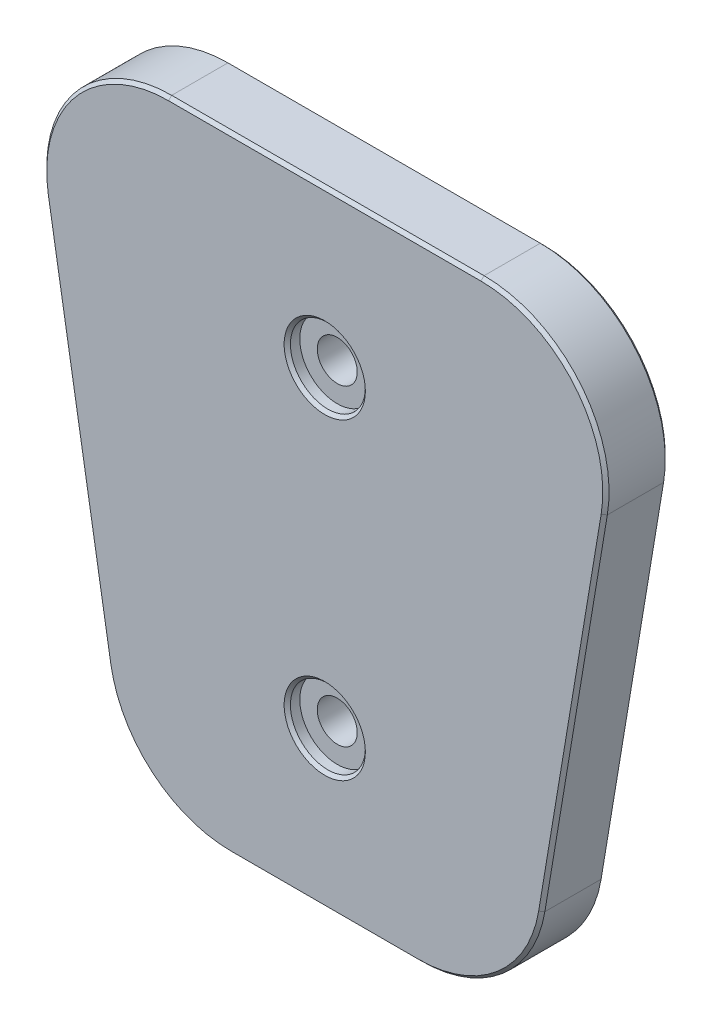
ISO-10303-21;
HEADER;
FILE_DESCRIPTION(('STEP AP214'),'2;1');
FILE_NAME('part.step','',(''),(''),'','','');
FILE_SCHEMA(('AUTOMOTIVE_DESIGN { 1 0 10303 214 1 1 1 1 }'));
ENDSEC;
DATA;
#1=APPLICATION_CONTEXT('core data for automotive mechanical design processes');
#2=APPLICATION_PROTOCOL_DEFINITION('international standard','automotive_design',2000,#1);
#3=PRODUCT_CONTEXT('',#1,'mechanical');
#4=PRODUCT('Part','Part','',(#3));
#5=PRODUCT_RELATED_PRODUCT_CATEGORY('part','',(#4));
#6=PRODUCT_DEFINITION_FORMATION('','',#4);
#7=PRODUCT_DEFINITION_CONTEXT('part definition',#1,'design');
#8=PRODUCT_DEFINITION('design','',#6,#7);
#9=PRODUCT_DEFINITION_SHAPE('','',#8);
#10=(LENGTH_UNIT() NAMED_UNIT(*) SI_UNIT(.MILLI.,.METRE.));
#11=(NAMED_UNIT(*) PLANE_ANGLE_UNIT() SI_UNIT($,.RADIAN.));
#12=(NAMED_UNIT(*) SI_UNIT($,.STERADIAN.) SOLID_ANGLE_UNIT());
#13=UNCERTAINTY_MEASURE_WITH_UNIT(LENGTH_MEASURE(1.E-05),#10,'distance_accuracy_value','');
#14=(GEOMETRIC_REPRESENTATION_CONTEXT(3) GLOBAL_UNCERTAINTY_ASSIGNED_CONTEXT((#13)) GLOBAL_UNIT_ASSIGNED_CONTEXT((#10,
#11,#12)) REPRESENTATION_CONTEXT('',''));
#15=CARTESIAN_POINT('',(0.,0.,0.));
#16=DIRECTION('',(0.,0.,1.));
#17=DIRECTION('',(1.,0.,0.));
#18=AXIS2_PLACEMENT_3D('',#15,#16,#17);
#19=CARTESIAN_POINT('',(-6.3552835393436,-23.2879797461072,10.));
#20=DIRECTION('',(0.986393923832144,0.164398987305357,0.));
#21=DIRECTION('',(-0.164398987305357,0.986393923832144,0.));
#22=AXIS2_PLACEMENT_3D('',#19,#20,#21);
#23=PLANE('',#22);
#24=DIRECTION('',(0.,0.,-1.));
#25=VECTOR('',#24,1.);
#26=CARTESIAN_POINT('',(-6.3552835393436,-23.2879797461072,10.));
#27=LINE('',#26,#25);
#28=CARTESIAN_POINT('',(-6.3552835393436,-23.2879797461072,9.49999999999999));
#29=VERTEX_POINT('',#28);
#30=CARTESIAN_POINT('',(-6.3552835393436,-23.2879797461072,0.499999999999999));
#31=VERTEX_POINT('',#30);
#32=EDGE_CURVE('E339',#29,#31,#27,.T.);
#33=ORIENTED_EDGE('',*,*,#32,.T.);
#34=DIRECTION('',(0.164398987305357,-0.986393923832144,0.));
#35=VECTOR('',#34,1.);
#36=CARTESIAN_POINT('',(-6.3552835393436,-23.2879797461072,0.499999999999999));
#37=LINE('',#36,#35);
#38=CARTESIAN_POINT('',(3.6447164606564,-83.2879797461072,0.499999999999999));
#39=VERTEX_POINT('',#38);
#40=EDGE_CURVE('E247',#31,#39,#37,.T.);
#41=ORIENTED_EDGE('',*,*,#40,.T.);
#42=DIRECTION('',(0.,0.,-1.));
#43=VECTOR('',#42,1.);
#44=CARTESIAN_POINT('',(3.6447164606564,-83.2879797461072,10.));
#45=LINE('',#44,#43);
#46=CARTESIAN_POINT('',(3.6447164606564,-83.2879797461072,9.49999999999999));
#47=VERTEX_POINT('',#46);
#48=EDGE_CURVE('E180',#47,#39,#45,.T.);
#49=ORIENTED_EDGE('',*,*,#48,.F.);
#50=DIRECTION('',(-0.164398987305357,0.986393923832144,0.));
#51=VECTOR('',#50,1.);
#52=CARTESIAN_POINT('',(-6.3552835393436,-23.2879797461072,9.49999999999999));
#53=LINE('',#52,#51);
#54=EDGE_CURVE('E245',#47,#29,#53,.T.);
#55=ORIENTED_EDGE('',*,*,#54,.T.);
#56=EDGE_LOOP('',(#33,#41,#49,#55));
#57=FACE_BOUND('',#56,.T.);
#58=ADVANCED_FACE('F41',(#57),#23,.F.);
#59=CARTESIAN_POINT('',(23.3725949372993,-80.,10.));
#60=DIRECTION('',(0.,0.,-1.));
#61=DIRECTION('',(-1.,0.,0.));
#62=AXIS2_PLACEMENT_3D('',#59,#60,#61);
#63=CYLINDRICAL_SURFACE('',#62,20.);
#64=ORIENTED_EDGE('',*,*,#48,.T.);
#65=CARTESIAN_POINT('',(23.3725949372993,-80.,0.5));
#66=DIRECTION('',(0.,0.,1.));
#67=DIRECTION('',(1.,0.,0.));
#68=AXIS2_PLACEMENT_3D('',#65,#66,#67);
#69=CIRCLE('',#68,20.);
#70=CARTESIAN_POINT('',(23.3725949372993,-100.,0.5));
#71=VERTEX_POINT('',#70);
#72=EDGE_CURVE('E179',#39,#71,#69,.T.);
#73=ORIENTED_EDGE('',*,*,#72,.T.);
#74=DIRECTION('',(0.,0.,-1.));
#75=VECTOR('',#74,1.);
#76=CARTESIAN_POINT('',(23.3725949372993,-100.,10.));
#77=LINE('',#76,#75);
#78=CARTESIAN_POINT('',(23.3725949372993,-100.,9.49999999999999));
#79=VERTEX_POINT('',#78);
#80=EDGE_CURVE('E161',#79,#71,#77,.T.);
#81=ORIENTED_EDGE('',*,*,#80,.F.);
#82=CARTESIAN_POINT('',(23.3725949372993,-80.,9.49999999999999));
#83=DIRECTION('',(0.,0.,1.));
#84=DIRECTION('',(1.,0.,0.));
#85=AXIS2_PLACEMENT_3D('',#82,#83,#84);
#86=CIRCLE('',#85,20.);
#87=EDGE_CURVE('E176',#79,#47,#86,.F.);
#88=ORIENTED_EDGE('',*,*,#87,.T.);
#89=EDGE_LOOP('',(#64,#73,#81,#88));
#90=FACE_BOUND('',#89,.T.);
#91=ADVANCED_FACE('F174',(#90),#63,.T.);
#92=CARTESIAN_POINT('',(23.3725949372993,-100.,10.));
#93=DIRECTION('',(0.,1.,0.));
#94=DIRECTION('',(0.,0.,1.));
#95=AXIS2_PLACEMENT_3D('',#92,#93,#94);
#96=PLANE('',#95);
#97=ORIENTED_EDGE('',*,*,#80,.T.);
#98=DIRECTION('',(1.,0.,0.));
#99=VECTOR('',#98,1.);
#100=CARTESIAN_POINT('',(23.3725949372993,-100.,0.5));
#101=LINE('',#100,#99);
#102=CARTESIAN_POINT('',(53.3725949372993,-100.,0.5));
#103=VERTEX_POINT('',#102);
#104=EDGE_CURVE('E168',#71,#103,#101,.T.);
#105=ORIENTED_EDGE('',*,*,#104,.T.);
#106=DIRECTION('',(0.,0.,-1.));
#107=VECTOR('',#106,1.);
#108=CARTESIAN_POINT('',(53.3725949372993,-100.,10.));
#109=LINE('',#108,#107);
#110=CARTESIAN_POINT('',(53.3725949372993,-100.,9.49999999999999));
#111=VERTEX_POINT('',#110);
#112=EDGE_CURVE('E163',#111,#103,#109,.T.);
#113=ORIENTED_EDGE('',*,*,#112,.F.);
#114=DIRECTION('',(-1.,0.,0.));
#115=VECTOR('',#114,1.);
#116=CARTESIAN_POINT('',(23.3725949372993,-100.,9.49999999999999));
#117=LINE('',#116,#115);
#118=EDGE_CURVE('E158',#111,#79,#117,.T.);
#119=ORIENTED_EDGE('',*,*,#118,.T.);
#120=EDGE_LOOP('',(#97,#105,#113,#119));
#121=FACE_BOUND('',#120,.T.);
#122=ADVANCED_FACE('F160',(#121),#96,.F.);
#123=CARTESIAN_POINT('',(53.3725949372993,-80.,10.));
#124=DIRECTION('',(0.,0.,-1.));
#125=DIRECTION('',(-1.,0.,0.));
#126=AXIS2_PLACEMENT_3D('',#123,#124,#125);
#127=CYLINDRICAL_SURFACE('',#126,20.);
#128=ORIENTED_EDGE('',*,*,#112,.T.);
#129=CARTESIAN_POINT('',(53.3725949372993,-80.,0.5));
#130=DIRECTION('',(0.,0.,1.));
#131=DIRECTION('',(1.,0.,0.));
#132=AXIS2_PLACEMENT_3D('',#129,#130,#131);
#133=CIRCLE('',#132,20.);
#134=CARTESIAN_POINT('',(73.1004734139422,-83.2879797461072,0.5));
#135=VERTEX_POINT('',#134);
#136=EDGE_CURVE('E226',#103,#135,#133,.T.);
#137=ORIENTED_EDGE('',*,*,#136,.T.);
#138=DIRECTION('',(0.,0.,-1.));
#139=VECTOR('',#138,1.);
#140=CARTESIAN_POINT('',(73.1004734139422,-83.2879797461072,10.));
#141=LINE('',#140,#139);
#142=CARTESIAN_POINT('',(73.1004734139422,-83.2879797461072,9.49999999999999));
#143=VERTEX_POINT('',#142);
#144=EDGE_CURVE('E324',#143,#135,#141,.T.);
#145=ORIENTED_EDGE('',*,*,#144,.F.);
#146=CARTESIAN_POINT('',(53.3725949372993,-80.,9.49999999999999));
#147=DIRECTION('',(0.,0.,1.));
#148=DIRECTION('',(1.,0.,0.));
#149=AXIS2_PLACEMENT_3D('',#146,#147,#148);
#150=CIRCLE('',#149,20.);
#151=EDGE_CURVE('E224',#143,#111,#150,.F.);
#152=ORIENTED_EDGE('',*,*,#151,.T.);
#153=EDGE_LOOP('',(#128,#137,#145,#152));
#154=FACE_BOUND('',#153,.T.);
#155=ADVANCED_FACE('F321',(#154),#127,.T.);
#156=CARTESIAN_POINT('',(73.1004734139422,-83.2879797461071,10.));
#157=DIRECTION('',(-0.986393923832144,0.164398987305357,0.));
#158=DIRECTION('',(-0.164398987305357,-0.986393923832144,0.));
#159=AXIS2_PLACEMENT_3D('',#156,#157,#158);
#160=PLANE('',#159);
#161=ORIENTED_EDGE('',*,*,#144,.T.);
#162=DIRECTION('',(0.164398987305357,0.986393923832144,0.));
#163=VECTOR('',#162,1.);
#164=CARTESIAN_POINT('',(73.1004734139422,-83.2879797461071,0.5));
#165=LINE('',#164,#163);
#166=CARTESIAN_POINT('',(83.1004734139421,-23.2879797461071,0.5));
#167=VERTEX_POINT('',#166);
#168=EDGE_CURVE('E230',#135,#167,#165,.T.);
#169=ORIENTED_EDGE('',*,*,#168,.T.);
#170=DIRECTION('',(0.,0.,-1.));
#171=VECTOR('',#170,1.);
#172=CARTESIAN_POINT('',(83.1004734139421,-23.2879797461071,10.));
#173=LINE('',#172,#171);
#174=CARTESIAN_POINT('',(83.1004734139421,-23.2879797461071,9.49999999999999));
#175=VERTEX_POINT('',#174);
#176=EDGE_CURVE('E327',#175,#167,#173,.T.);
#177=ORIENTED_EDGE('',*,*,#176,.F.);
#178=DIRECTION('',(-0.164398987305357,-0.986393923832144,0.));
#179=VECTOR('',#178,1.);
#180=CARTESIAN_POINT('',(73.1004734139422,-83.2879797461072,9.49999999999999));
#181=LINE('',#180,#179);
#182=EDGE_CURVE('E228',#175,#143,#181,.T.);
#183=ORIENTED_EDGE('',*,*,#182,.T.);
#184=EDGE_LOOP('',(#161,#169,#177,#183));
#185=FACE_BOUND('',#184,.T.);
#186=ADVANCED_FACE('F541',(#185),#160,.F.);
#187=CARTESIAN_POINT('',(63.3725949372993,-20.,10.));
#188=DIRECTION('',(0.,0.,-1.));
#189=DIRECTION('',(-1.,0.,0.));
#190=AXIS2_PLACEMENT_3D('',#187,#188,#189);
#191=CYLINDRICAL_SURFACE('',#190,20.);
#192=ORIENTED_EDGE('',*,*,#176,.T.);
#193=CARTESIAN_POINT('',(63.3725949372993,-20.,0.5));
#194=DIRECTION('',(0.,0.,1.));
#195=DIRECTION('',(1.,0.,0.));
#196=AXIS2_PLACEMENT_3D('',#193,#194,#195);
#197=CIRCLE('',#196,20.);
#198=CARTESIAN_POINT('',(63.3725949372993,0.,0.5));
#199=VERTEX_POINT('',#198);
#200=EDGE_CURVE('E234',#167,#199,#197,.T.);
#201=ORIENTED_EDGE('',*,*,#200,.T.);
#202=DIRECTION('',(0.,0.,-1.));
#203=VECTOR('',#202,1.);
#204=CARTESIAN_POINT('',(63.3725949372993,0.,10.));
#205=LINE('',#204,#203);
#206=CARTESIAN_POINT('',(63.3725949372993,0.,9.49999999999999));
#207=VERTEX_POINT('',#206);
#208=EDGE_CURVE('E331',#207,#199,#205,.T.);
#209=ORIENTED_EDGE('',*,*,#208,.F.);
#210=CARTESIAN_POINT('',(63.3725949372993,-20.,9.49999999999999));
#211=DIRECTION('',(0.,0.,1.));
#212=DIRECTION('',(1.,0.,0.));
#213=AXIS2_PLACEMENT_3D('',#210,#211,#212);
#214=CIRCLE('',#213,20.);
#215=EDGE_CURVE('E232',#207,#175,#214,.F.);
#216=ORIENTED_EDGE('',*,*,#215,.T.);
#217=EDGE_LOOP('',(#192,#201,#209,#216));
#218=FACE_BOUND('',#217,.T.);
#219=ADVANCED_FACE('F537',(#218),#191,.T.);
#220=CARTESIAN_POINT('',(13.3725949372993,0.,10.));
#221=DIRECTION('',(0.,1.,0.));
#222=DIRECTION('',(-1.,0.,0.));
#223=AXIS2_PLACEMENT_3D('',#220,#221,#222);
#224=PLANE('',#223);
#225=ORIENTED_EDGE('',*,*,#208,.T.);
#226=DIRECTION('',(-1.,0.,0.));
#227=VECTOR('',#226,1.);
#228=CARTESIAN_POINT('',(13.3725949372993,0.,0.5));
#229=LINE('',#228,#227);
#230=CARTESIAN_POINT('',(13.3725949372993,0.,0.5));
#231=VERTEX_POINT('',#230);
#232=EDGE_CURVE('E238',#199,#231,#229,.T.);
#233=ORIENTED_EDGE('',*,*,#232,.T.);
#234=DIRECTION('',(0.,0.,-1.));
#235=VECTOR('',#234,1.);
#236=CARTESIAN_POINT('',(13.3725949372993,0.,10.));
#237=LINE('',#236,#235);
#238=CARTESIAN_POINT('',(13.3725949372993,0.,9.49999999999999));
#239=VERTEX_POINT('',#238);
#240=EDGE_CURVE('E336',#239,#231,#237,.T.);
#241=ORIENTED_EDGE('',*,*,#240,.F.);
#242=DIRECTION('',(1.,0.,0.));
#243=VECTOR('',#242,1.);
#244=CARTESIAN_POINT('',(13.3725949372993,0.,9.49999999999999));
#245=LINE('',#244,#243);
#246=EDGE_CURVE('E236',#239,#207,#245,.T.);
#247=ORIENTED_EDGE('',*,*,#246,.T.);
#248=EDGE_LOOP('',(#225,#233,#241,#247));
#249=FACE_BOUND('',#248,.T.);
#250=ADVANCED_FACE('F533',(#249),#224,.T.);
#251=CARTESIAN_POINT('',(13.3725949372993,-20.,10.));
#252=DIRECTION('',(0.,0.,-1.));
#253=DIRECTION('',(-1.,0.,0.));
#254=AXIS2_PLACEMENT_3D('',#251,#252,#253);
#255=CYLINDRICAL_SURFACE('',#254,20.);
#256=ORIENTED_EDGE('',*,*,#240,.T.);
#257=CARTESIAN_POINT('',(13.3725949372993,-20.,0.5));
#258=DIRECTION('',(0.,0.,1.));
#259=DIRECTION('',(1.,0.,0.));
#260=AXIS2_PLACEMENT_3D('',#257,#258,#259);
#261=CIRCLE('',#260,20.);
#262=EDGE_CURVE('E243',#231,#31,#261,.T.);
#263=ORIENTED_EDGE('',*,*,#262,.T.);
#264=ORIENTED_EDGE('',*,*,#32,.F.);
#265=CARTESIAN_POINT('',(13.3725949372993,-20.,9.49999999999999));
#266=DIRECTION('',(0.,0.,1.));
#267=DIRECTION('',(1.,0.,0.));
#268=AXIS2_PLACEMENT_3D('',#265,#266,#267);
#269=CIRCLE('',#268,20.);
#270=EDGE_CURVE('E240',#29,#239,#269,.F.);
#271=ORIENTED_EDGE('',*,*,#270,.T.);
#272=EDGE_LOOP('',(#256,#263,#264,#271));
#273=FACE_BOUND('',#272,.T.);
#274=ADVANCED_FACE('F529',(#273),#255,.T.);
#275=CARTESIAN_POINT('',(23.3725949372993,-80.,10.));
#276=DIRECTION('',(0.,0.,1.));
#277=DIRECTION('',(1.,0.,0.));
#278=AXIS2_PLACEMENT_3D('',#275,#276,#277);
#279=PLANE('',#278);
#280=DIRECTION('',(-1.,0.,0.));
#281=VECTOR('',#280,1.);
#282=CARTESIAN_POINT('',(23.3725949372993,-0.500000000000014,10.));
#283=LINE('',#282,#281);
#284=CARTESIAN_POINT('',(63.3725949372993,-0.500000000000016,10.));
#285=VERTEX_POINT('',#284);
#286=CARTESIAN_POINT('',(13.3725949372993,-0.500000000000016,10.));
#287=VERTEX_POINT('',#286);
#288=EDGE_CURVE('E59',#285,#287,#283,.T.);
#289=ORIENTED_EDGE('',*,*,#288,.T.);
#290=CARTESIAN_POINT('',(13.3725949372993,-20.,10.));
#291=DIRECTION('',(0.,0.,1.));
#292=DIRECTION('',(1.,0.,0.));
#293=AXIS2_PLACEMENT_3D('',#290,#291,#292);
#294=CIRCLE('',#293,19.5);
#295=CARTESIAN_POINT('',(-5.86208657742751,-23.2057802524545,10.));
#296=VERTEX_POINT('',#295);
#297=EDGE_CURVE('E272',#287,#296,#294,.T.);
#298=ORIENTED_EDGE('',*,*,#297,.T.);
#299=DIRECTION('',(0.164398987305357,-0.986393923832144,0.));
#300=VECTOR('',#299,1.);
#301=CARTESIAN_POINT('',(4.13791342257249,-83.2057802524545,10.));
#302=LINE('',#301,#300);
#303=CARTESIAN_POINT('',(4.13791342257249,-83.2057802524545,10.));
#304=VERTEX_POINT('',#303);
#305=EDGE_CURVE('E261',#296,#304,#302,.T.);
#306=ORIENTED_EDGE('',*,*,#305,.T.);
#307=CARTESIAN_POINT('',(23.3725949372993,-80.,10.));
#308=DIRECTION('',(0.,0.,1.));
#309=DIRECTION('',(1.,0.,0.));
#310=AXIS2_PLACEMENT_3D('',#307,#308,#309);
#311=CIRCLE('',#310,19.5);
#312=CARTESIAN_POINT('',(23.3725949372993,-99.5,10.));
#313=VERTEX_POINT('',#312);
#314=EDGE_CURVE('E263',#304,#313,#311,.T.);
#315=ORIENTED_EDGE('',*,*,#314,.T.);
#316=DIRECTION('',(1.,0.,0.));
#317=VECTOR('',#316,1.);
#318=CARTESIAN_POINT('',(53.3725949372993,-99.5,10.));
#319=LINE('',#318,#317);
#320=CARTESIAN_POINT('',(53.3725949372993,-99.5,10.));
#321=VERTEX_POINT('',#320);
#322=EDGE_CURVE('E186',#313,#321,#319,.T.);
#323=ORIENTED_EDGE('',*,*,#322,.T.);
#324=CARTESIAN_POINT('',(53.3725949372993,-80.,10.));
#325=DIRECTION('',(0.,0.,1.));
#326=DIRECTION('',(1.,0.,0.));
#327=AXIS2_PLACEMENT_3D('',#324,#325,#326);
#328=CIRCLE('',#327,19.5);
#329=CARTESIAN_POINT('',(72.6072764520261,-83.2057802524545,10.));
#330=VERTEX_POINT('',#329);
#331=EDGE_CURVE('E266',#321,#330,#328,.T.);
#332=ORIENTED_EDGE('',*,*,#331,.T.);
#333=DIRECTION('',(0.164398987305357,0.986393923832144,0.));
#334=VECTOR('',#333,1.);
#335=CARTESIAN_POINT('',(82.607276452026,-23.2057802524545,10.));
#336=LINE('',#335,#334);
#337=CARTESIAN_POINT('',(82.607276452026,-23.2057802524545,10.));
#338=VERTEX_POINT('',#337);
#339=EDGE_CURVE('E268',#330,#338,#336,.T.);
#340=ORIENTED_EDGE('',*,*,#339,.T.);
#341=CARTESIAN_POINT('',(63.3725949372993,-20.,10.));
#342=DIRECTION('',(0.,0.,1.));
#343=DIRECTION('',(1.,0.,0.));
#344=AXIS2_PLACEMENT_3D('',#341,#342,#343);
#345=CIRCLE('',#344,19.5);
#346=EDGE_CURVE('E64',#338,#285,#345,.T.);
#347=ORIENTED_EDGE('',*,*,#346,.T.);
#348=EDGE_LOOP('',(#289,#298,#306,#315,#323,#332,#340,#347));
#349=FACE_BOUND('',#348,.T.);
#350=CARTESIAN_POINT('',(38.3725949372993,-75.,10.));
#351=DIRECTION('',(0.,0.,1.));
#352=DIRECTION('',(1.,0.,0.));
#353=AXIS2_PLACEMENT_3D('',#350,#351,#352);
#354=CIRCLE('',#353,6.50000000000001);
#355=CARTESIAN_POINT('',(44.8725949372993,-75.,10.));
#356=VERTEX_POINT('',#355);
#357=EDGE_CURVE('E258',#356,#356,#354,.F.);
#358=ORIENTED_EDGE('',*,*,#357,.T.);
#359=EDGE_LOOP('',(#358));
#360=FACE_BOUND('',#359,.T.);
#361=CARTESIAN_POINT('',(38.3725949372993,-25.,10.));
#362=DIRECTION('',(0.,0.,1.));
#363=DIRECTION('',(1.,0.,0.));
#364=AXIS2_PLACEMENT_3D('',#361,#362,#363);
#365=CIRCLE('',#364,6.49999999999998);
#366=CARTESIAN_POINT('',(44.8725949372992,-25.,10.));
#367=VERTEX_POINT('',#366);
#368=EDGE_CURVE('E255',#367,#367,#365,.F.);
#369=ORIENTED_EDGE('',*,*,#368,.T.);
#370=EDGE_LOOP('',(#369));
#371=FACE_BOUND('',#370,.T.);
#372=ADVANCED_FACE('F524',(#349,#360,#371),#279,.T.);
#373=CARTESIAN_POINT('',(23.3725949372993,-80.,0.));
#374=DIRECTION('',(0.,0.,1.));
#375=DIRECTION('',(1.,0.,0.));
#376=AXIS2_PLACEMENT_3D('',#373,#374,#375);
#377=PLANE('',#376);
#378=DIRECTION('',(-1.,0.,0.));
#379=VECTOR('',#378,1.);
#380=CARTESIAN_POINT('',(23.3725949372993,-99.5,0.));
#381=LINE('',#380,#379);
#382=CARTESIAN_POINT('',(53.3725949372993,-99.5,0.));
#383=VERTEX_POINT('',#382);
#384=CARTESIAN_POINT('',(23.3725949372993,-99.5,0.));
#385=VERTEX_POINT('',#384);
#386=EDGE_CURVE('E219',#383,#385,#381,.T.);
#387=ORIENTED_EDGE('',*,*,#386,.T.);
#388=CARTESIAN_POINT('',(23.3725949372993,-80.,0.));
#389=DIRECTION('',(0.,0.,1.));
#390=DIRECTION('',(1.,0.,0.));
#391=AXIS2_PLACEMENT_3D('',#388,#389,#390);
#392=CIRCLE('',#391,19.5);
#393=CARTESIAN_POINT('',(4.13791342257246,-83.2057802524545,0.));
#394=VERTEX_POINT('',#393);
#395=EDGE_CURVE('E169',#385,#394,#392,.F.);
#396=ORIENTED_EDGE('',*,*,#395,.T.);
#397=DIRECTION('',(-0.164398987305357,0.986393923832144,0.));
#398=VECTOR('',#397,1.);
#399=CARTESIAN_POINT('',(4.13791342257245,-83.2057802524545,0.));
#400=LINE('',#399,#398);
#401=CARTESIAN_POINT('',(-5.86208657742754,-23.2057802524545,0.));
#402=VERTEX_POINT('',#401);
#403=EDGE_CURVE('E207',#394,#402,#400,.T.);
#404=ORIENTED_EDGE('',*,*,#403,.T.);
#405=CARTESIAN_POINT('',(13.3725949372993,-20.,0.));
#406=DIRECTION('',(0.,0.,1.));
#407=DIRECTION('',(1.,0.,0.));
#408=AXIS2_PLACEMENT_3D('',#405,#406,#407);
#409=CIRCLE('',#408,19.5);
#410=CARTESIAN_POINT('',(13.3725949372993,-0.499999999999995,0.));
#411=VERTEX_POINT('',#410);
#412=EDGE_CURVE('E209',#402,#411,#409,.F.);
#413=ORIENTED_EDGE('',*,*,#412,.T.);
#414=DIRECTION('',(1.,0.,0.));
#415=VECTOR('',#414,1.);
#416=CARTESIAN_POINT('',(63.3725949372993,-0.499999999999982,0.));
#417=LINE('',#416,#415);
#418=CARTESIAN_POINT('',(63.3725949372993,-0.499999999999982,0.));
#419=VERTEX_POINT('',#418);
#420=EDGE_CURVE('E211',#411,#419,#417,.T.);
#421=ORIENTED_EDGE('',*,*,#420,.T.);
#422=CARTESIAN_POINT('',(63.3725949372993,-20.,0.));
#423=DIRECTION('',(0.,0.,1.));
#424=DIRECTION('',(1.,0.,0.));
#425=AXIS2_PLACEMENT_3D('',#422,#423,#424);
#426=CIRCLE('',#425,19.5);
#427=CARTESIAN_POINT('',(82.6072764520261,-23.2057802524545,0.));
#428=VERTEX_POINT('',#427);
#429=EDGE_CURVE('E213',#419,#428,#426,.F.);
#430=ORIENTED_EDGE('',*,*,#429,.T.);
#431=DIRECTION('',(-0.164398987305357,-0.986393923832144,0.));
#432=VECTOR('',#431,1.);
#433=CARTESIAN_POINT('',(71.7964656412153,-88.0706451173193,0.));
#434=LINE('',#433,#432);
#435=CARTESIAN_POINT('',(72.6072764520261,-83.2057802524545,0.));
#436=VERTEX_POINT('',#435);
#437=EDGE_CURVE('E215',#428,#436,#434,.T.);
#438=ORIENTED_EDGE('',*,*,#437,.T.);
#439=CARTESIAN_POINT('',(53.3725949372993,-80.,0.));
#440=DIRECTION('',(0.,0.,1.));
#441=DIRECTION('',(1.,0.,0.));
#442=AXIS2_PLACEMENT_3D('',#439,#440,#441);
#443=CIRCLE('',#442,19.5);
#444=EDGE_CURVE('E217',#436,#383,#443,.F.);
#445=ORIENTED_EDGE('',*,*,#444,.T.);
#446=EDGE_LOOP('',(#387,#396,#404,#413,#421,#430,#438,#445));
#447=FACE_BOUND('',#446,.T.);
#448=CARTESIAN_POINT('',(38.3725949372993,-75.,0.));
#449=DIRECTION('',(0.,0.,1.));
#450=DIRECTION('',(1.,0.,0.));
#451=AXIS2_PLACEMENT_3D('',#448,#449,#450);
#452=CIRCLE('',#451,3.70000000000004);
#453=CARTESIAN_POINT('',(42.0725949372993,-75.,0.));
#454=VERTEX_POINT('',#453);
#455=EDGE_CURVE('E204',#454,#454,#452,.T.);
#456=ORIENTED_EDGE('',*,*,#455,.T.);
#457=EDGE_LOOP('',(#456));
#458=FACE_BOUND('',#457,.T.);
#459=CARTESIAN_POINT('',(38.3725949372993,-25.,0.));
#460=DIRECTION('',(0.,0.,1.));
#461=DIRECTION('',(1.,0.,0.));
#462=AXIS2_PLACEMENT_3D('',#459,#460,#461);
#463=CIRCLE('',#462,3.70000000000004);
#464=CARTESIAN_POINT('',(42.0725949372993,-25.,0.));
#465=VERTEX_POINT('',#464);
#466=EDGE_CURVE('E198',#465,#465,#463,.T.);
#467=ORIENTED_EDGE('',*,*,#466,.T.);
#468=EDGE_LOOP('',(#467));
#469=FACE_BOUND('',#468,.T.);
#470=ADVANCED_FACE('F518',(#447,#458,#469),#377,.F.);
#471=CARTESIAN_POINT('',(38.3725949372993,-75.,8.));
#472=DIRECTION('',(0.,0.,1.));
#473=DIRECTION('',(1.,0.,0.));
#474=AXIS2_PLACEMENT_3D('',#471,#472,#473);
#475=CYLINDRICAL_SURFACE('',#474,6.00000000000001);
#476=CARTESIAN_POINT('',(38.3725949372993,-75.,9.50000000000001));
#477=DIRECTION('',(0.,0.,1.));
#478=DIRECTION('',(1.,0.,0.));
#479=AXIS2_PLACEMENT_3D('',#476,#477,#478);
#480=CIRCLE('',#479,6.00000000000001);
#481=CARTESIAN_POINT('',(44.3725949372993,-75.,9.50000000000001));
#482=VERTEX_POINT('',#481);
#483=EDGE_CURVE('E51',#482,#482,#480,.T.);
#484=ORIENTED_EDGE('',*,*,#483,.T.);
#485=EDGE_LOOP('',(#484));
#486=FACE_BOUND('',#485,.T.);
#487=CARTESIAN_POINT('',(38.3725949372993,-75.,8.));
#488=DIRECTION('',(0.,0.,1.));
#489=DIRECTION('',(1.,0.,0.));
#490=AXIS2_PLACEMENT_3D('',#487,#488,#489);
#491=CIRCLE('',#490,6.00000000000001);
#492=CARTESIAN_POINT('',(44.3725949372993,-75.,8.));
#493=VERTEX_POINT('',#492);
#494=EDGE_CURVE('E343',#493,#493,#491,.T.);
#495=ORIENTED_EDGE('',*,*,#494,.F.);
#496=EDGE_LOOP('',(#495));
#497=FACE_BOUND('',#496,.T.);
#498=ADVANCED_FACE('F373',(#486,#497),#475,.F.);
#499=CARTESIAN_POINT('',(38.3725949372993,-75.,8.));
#500=DIRECTION('',(0.,0.,1.));
#501=DIRECTION('',(1.,0.,0.));
#502=AXIS2_PLACEMENT_3D('',#499,#500,#501);
#503=PLANE('',#502);
#504=CARTESIAN_POINT('',(38.3725949372993,-75.,8.));
#505=DIRECTION('',(0.,0.,1.));
#506=DIRECTION('',(1.,0.,0.));
#507=AXIS2_PLACEMENT_3D('',#504,#505,#506);
#508=CIRCLE('',#507,3.19999999999999);
#509=CARTESIAN_POINT('',(41.5725949372993,-75.,8.));
#510=VERTEX_POINT('',#509);
#511=EDGE_CURVE('E298',#510,#510,#508,.T.);
#512=ORIENTED_EDGE('',*,*,#511,.F.);
#513=EDGE_LOOP('',(#512));
#514=FACE_BOUND('',#513,.T.);
#515=ORIENTED_EDGE('',*,*,#494,.T.);
#516=EDGE_LOOP('',(#515));
#517=FACE_BOUND('',#516,.T.);
#518=ADVANCED_FACE('F365',(#514,#517),#503,.T.);
#519=CARTESIAN_POINT('',(38.3725949372993,-25.,8.));
#520=DIRECTION('',(0.,0.,1.));
#521=DIRECTION('',(1.,0.,0.));
#522=AXIS2_PLACEMENT_3D('',#519,#520,#521);
#523=CYLINDRICAL_SURFACE('',#522,5.99999999999999);
#524=CARTESIAN_POINT('',(38.3725949372993,-25.,9.50000000000003));
#525=DIRECTION('',(0.,0.,1.));
#526=DIRECTION('',(1.,0.,0.));
#527=AXIS2_PLACEMENT_3D('',#524,#525,#526);
#528=CIRCLE('',#527,5.99999999999999);
#529=CARTESIAN_POINT('',(44.3725949372993,-25.,9.50000000000003));
#530=VERTEX_POINT('',#529);
#531=EDGE_CURVE('E11',#530,#530,#528,.T.);
#532=ORIENTED_EDGE('',*,*,#531,.T.);
#533=EDGE_LOOP('',(#532));
#534=FACE_BOUND('',#533,.T.);
#535=CARTESIAN_POINT('',(38.3725949372993,-25.,8.));
#536=DIRECTION('',(0.,0.,1.));
#537=DIRECTION('',(1.,0.,0.));
#538=AXIS2_PLACEMENT_3D('',#535,#536,#537);
#539=CIRCLE('',#538,5.99999999999999);
#540=CARTESIAN_POINT('',(44.3725949372993,-25.,8.));
#541=VERTEX_POINT('',#540);
#542=EDGE_CURVE('E342',#541,#541,#539,.T.);
#543=ORIENTED_EDGE('',*,*,#542,.F.);
#544=EDGE_LOOP('',(#543));
#545=FACE_BOUND('',#544,.T.);
#546=ADVANCED_FACE('F360',(#534,#545),#523,.F.);
#547=CARTESIAN_POINT('',(38.3725949372993,-25.,8.));
#548=DIRECTION('',(0.,0.,1.));
#549=DIRECTION('',(1.,0.,0.));
#550=AXIS2_PLACEMENT_3D('',#547,#548,#549);
#551=PLANE('',#550);
#552=CARTESIAN_POINT('',(38.3725949372993,-25.,8.));
#553=DIRECTION('',(0.,0.,1.));
#554=DIRECTION('',(1.,0.,0.));
#555=AXIS2_PLACEMENT_3D('',#552,#553,#554);
#556=CIRCLE('',#555,3.2);
#557=CARTESIAN_POINT('',(41.5725949372993,-25.,8.));
#558=VERTEX_POINT('',#557);
#559=EDGE_CURVE('E346',#558,#558,#556,.T.);
#560=ORIENTED_EDGE('',*,*,#559,.F.);
#561=EDGE_LOOP('',(#560));
#562=FACE_BOUND('',#561,.T.);
#563=ORIENTED_EDGE('',*,*,#542,.T.);
#564=EDGE_LOOP('',(#563));
#565=FACE_BOUND('',#564,.T.);
#566=ADVANCED_FACE('F356',(#562,#565),#551,.T.);
#567=CARTESIAN_POINT('',(38.3725949372993,-75.,0.));
#568=DIRECTION('',(0.,0.,1.));
#569=DIRECTION('',(1.,0.,0.));
#570=AXIS2_PLACEMENT_3D('',#567,#568,#569);
#571=CYLINDRICAL_SURFACE('',#570,3.19999999999999);
#572=CARTESIAN_POINT('',(38.3725949372993,-75.,0.500000000000039));
#573=DIRECTION('',(0.,0.,1.));
#574=DIRECTION('',(1.,0.,0.));
#575=AXIS2_PLACEMENT_3D('',#572,#573,#574);
#576=CIRCLE('',#575,3.19999999999999);
#577=CARTESIAN_POINT('',(41.5725949372993,-75.,0.500000000000039));
#578=VERTEX_POINT('',#577);
#579=EDGE_CURVE('E249',#578,#578,#576,.F.);
#580=ORIENTED_EDGE('',*,*,#579,.T.);
#581=EDGE_LOOP('',(#580));
#582=FACE_BOUND('',#581,.T.);
#583=ORIENTED_EDGE('',*,*,#511,.T.);
#584=EDGE_LOOP('',(#583));
#585=FACE_BOUND('',#584,.T.);
#586=ADVANCED_FACE('F359',(#582,#585),#571,.F.);
#587=CARTESIAN_POINT('',(38.3725949372993,-25.,0.));
#588=DIRECTION('',(0.,0.,1.));
#589=DIRECTION('',(1.,0.,0.));
#590=AXIS2_PLACEMENT_3D('',#587,#588,#589);
#591=CYLINDRICAL_SURFACE('',#590,3.2);
#592=CARTESIAN_POINT('',(38.3725949372993,-25.,0.50000000000003));
#593=DIRECTION('',(0.,0.,1.));
#594=DIRECTION('',(1.,0.,0.));
#595=AXIS2_PLACEMENT_3D('',#592,#593,#594);
#596=CIRCLE('',#595,3.2);
#597=CARTESIAN_POINT('',(41.5725949372993,-25.,0.50000000000003));
#598=VERTEX_POINT('',#597);
#599=EDGE_CURVE('E252',#598,#598,#596,.F.);
#600=ORIENTED_EDGE('',*,*,#599,.T.);
#601=EDGE_LOOP('',(#600));
#602=FACE_BOUND('',#601,.T.);
#603=ORIENTED_EDGE('',*,*,#559,.T.);
#604=EDGE_LOOP('',(#603));
#605=FACE_BOUND('',#604,.T.);
#606=ADVANCED_FACE('F354',(#602,#605),#591,.F.);
#607=CARTESIAN_POINT('',(63.3725949372993,-20.,0.));
#608=DIRECTION('',(0.,0.,1.));
#609=DIRECTION('',(1.,0.,0.));
#610=AXIS2_PLACEMENT_3D('',#607,#608,#609);
#611=CONICAL_SURFACE('',#610,19.5,0.785398163397445);
#612=DIRECTION('',(0.697485832462909,-0.116247638743816,0.707106781186555));
#613=VECTOR('',#612,1.);
#614=CARTESIAN_POINT('',(82.6072764520261,-23.2057802524545,0.));
#615=LINE('',#614,#613);
#616=EDGE_CURVE('E292',#428,#167,#615,.T.);
#617=ORIENTED_EDGE('',*,*,#616,.F.);
#618=ORIENTED_EDGE('',*,*,#429,.F.);
#619=DIRECTION('',(0.,-0.707106781186545,-0.70710678118655));
#620=VECTOR('',#619,1.);
#621=CARTESIAN_POINT('',(63.3725949372993,0.,0.5));
#622=LINE('',#621,#620);
#623=EDGE_CURVE('E295',#199,#419,#622,.T.);
#624=ORIENTED_EDGE('',*,*,#623,.F.);
#625=ORIENTED_EDGE('',*,*,#200,.F.);
#626=EDGE_LOOP('',(#617,#618,#624,#625));
#627=FACE_BOUND('',#626,.T.);
#628=ADVANCED_FACE('F437',(#627),#611,.T.);
#629=CARTESIAN_POINT('',(23.3725949372993,-0.499999999999987,0.));
#630=DIRECTION('',(0.,0.707106781186556,-0.707106781186539));
#631=DIRECTION('',(-1.,0.,0.));
#632=AXIS2_PLACEMENT_3D('',#629,#630,#631);
#633=PLANE('',#632);
#634=ORIENTED_EDGE('',*,*,#623,.T.);
#635=ORIENTED_EDGE('',*,*,#420,.F.);
#636=DIRECTION('',(0.,-0.707106781186539,-0.707106781186556));
#637=VECTOR('',#636,1.);
#638=CARTESIAN_POINT('',(13.3725949372993,0.,0.5));
#639=LINE('',#638,#637);
#640=EDGE_CURVE('E289',#231,#411,#639,.T.);
#641=ORIENTED_EDGE('',*,*,#640,.F.);
#642=ORIENTED_EDGE('',*,*,#232,.F.);
#643=EDGE_LOOP('',(#634,#635,#641,#642));
#644=FACE_BOUND('',#643,.T.);
#645=ADVANCED_FACE('F430',(#644),#633,.T.);
#646=CARTESIAN_POINT('',(73.1004734139422,-83.2879797461071,0.5));
#647=DIRECTION('',(-0.697485832462917,0.116247638743819,0.707106781186546));
#648=DIRECTION('',(0.164398987305357,0.986393923832144,0.));
#649=AXIS2_PLACEMENT_3D('',#646,#647,#648);
#650=PLANE('',#649);
#651=ORIENTED_EDGE('',*,*,#616,.T.);
#652=ORIENTED_EDGE('',*,*,#168,.F.);
#653=DIRECTION('',(0.697485832462918,-0.11624763874382,0.707106781186545));
#654=VECTOR('',#653,1.);
#655=CARTESIAN_POINT('',(72.6072764520261,-83.2057802524545,0.));
#656=LINE('',#655,#654);
#657=EDGE_CURVE('E286',#436,#135,#656,.T.);
#658=ORIENTED_EDGE('',*,*,#657,.F.);
#659=ORIENTED_EDGE('',*,*,#437,.F.);
#660=EDGE_LOOP('',(#651,#652,#658,#659));
#661=FACE_BOUND('',#660,.T.);
#662=ADVANCED_FACE('F423',(#661),#650,.F.);
#663=CARTESIAN_POINT('',(13.3725949372993,-20.,0.5));
#664=DIRECTION('',(0.,0.,1.));
#665=DIRECTION('',(1.,0.,0.));
#666=AXIS2_PLACEMENT_3D('',#663,#664,#665);
#667=CONICAL_SURFACE('',#666,20.,0.785398163397438);
#668=ORIENTED_EDGE('',*,*,#640,.T.);
#669=ORIENTED_EDGE('',*,*,#412,.F.);
#670=DIRECTION('',(0.697485832462909,0.116247638743816,-0.707106781186554));
#671=VECTOR('',#670,1.);
#672=CARTESIAN_POINT('',(-6.3552835393436,-23.2879797461072,0.5));
#673=LINE('',#672,#671);
#674=EDGE_CURVE('E283',#31,#402,#673,.T.);
#675=ORIENTED_EDGE('',*,*,#674,.F.);
#676=ORIENTED_EDGE('',*,*,#262,.F.);
#677=EDGE_LOOP('',(#668,#669,#675,#676));
#678=FACE_BOUND('',#677,.T.);
#679=ADVANCED_FACE('F416',(#678),#667,.T.);
#680=CARTESIAN_POINT('',(53.3725949372993,-80.,0.5));
#681=DIRECTION('',(0.,0.,1.));
#682=DIRECTION('',(1.,0.,0.));
#683=AXIS2_PLACEMENT_3D('',#680,#681,#682);
#684=CONICAL_SURFACE('',#683,20.,0.785398163397435);
#685=ORIENTED_EDGE('',*,*,#657,.T.);
#686=ORIENTED_EDGE('',*,*,#136,.F.);
#687=DIRECTION('',(0.,-0.707106781186538,0.707106781186557));
#688=VECTOR('',#687,1.);
#689=CARTESIAN_POINT('',(53.3725949372993,-99.5,0.));
#690=LINE('',#689,#688);
#691=EDGE_CURVE('E280',#383,#103,#690,.T.);
#692=ORIENTED_EDGE('',*,*,#691,.F.);
#693=ORIENTED_EDGE('',*,*,#444,.F.);
#694=EDGE_LOOP('',(#685,#686,#692,#693));
#695=FACE_BOUND('',#694,.T.);
#696=ADVANCED_FACE('F409',(#695),#684,.T.);
#697=CARTESIAN_POINT('',(-6.3552835393436,-23.2879797461072,0.5));
#698=DIRECTION('',(0.697485832462923,0.11624763874382,0.70710678118654));
#699=DIRECTION('',(0.164398987305357,-0.986393923832144,0.));
#700=AXIS2_PLACEMENT_3D('',#697,#698,#699);
#701=PLANE('',#700);
#702=ORIENTED_EDGE('',*,*,#674,.T.);
#703=ORIENTED_EDGE('',*,*,#403,.F.);
#704=DIRECTION('',(0.697485832462908,0.116247638743822,-0.707106781186555));
#705=VECTOR('',#704,1.);
#706=CARTESIAN_POINT('',(3.64471646065639,-83.2879797461072,0.499999999999999));
#707=LINE('',#706,#705);
#708=EDGE_CURVE('E278',#39,#394,#707,.T.);
#709=ORIENTED_EDGE('',*,*,#708,.F.);
#710=ORIENTED_EDGE('',*,*,#40,.F.);
#711=EDGE_LOOP('',(#702,#703,#709,#710));
#712=FACE_BOUND('',#711,.T.);
#713=ADVANCED_FACE('F402',(#712),#701,.F.);
#714=CARTESIAN_POINT('',(23.3725949372993,-100.,0.5));
#715=DIRECTION('',(0.,0.707106781186557,0.707106781186538));
#716=DIRECTION('',(1.,0.,0.));
#717=AXIS2_PLACEMENT_3D('',#714,#715,#716);
#718=PLANE('',#717);
#719=ORIENTED_EDGE('',*,*,#691,.T.);
#720=ORIENTED_EDGE('',*,*,#104,.F.);
#721=DIRECTION('',(0.,-0.707106781186538,0.707106781186557));
#722=VECTOR('',#721,1.);
#723=CARTESIAN_POINT('',(23.3725949372993,-99.5,0.));
#724=LINE('',#723,#722);
#725=EDGE_CURVE('E276',#385,#71,#724,.T.);
#726=ORIENTED_EDGE('',*,*,#725,.F.);
#727=ORIENTED_EDGE('',*,*,#386,.F.);
#728=EDGE_LOOP('',(#719,#720,#726,#727));
#729=FACE_BOUND('',#728,.T.);
#730=ADVANCED_FACE('F395',(#729),#718,.F.);
#731=CARTESIAN_POINT('',(23.3725949372993,-80.,0.5));
#732=DIRECTION('',(0.,0.,1.));
#733=DIRECTION('',(1.,0.,0.));
#734=AXIS2_PLACEMENT_3D('',#731,#732,#733);
#735=CONICAL_SURFACE('',#734,20.,0.785398163397438);
#736=ORIENTED_EDGE('',*,*,#708,.T.);
#737=ORIENTED_EDGE('',*,*,#395,.F.);
#738=ORIENTED_EDGE('',*,*,#725,.T.);
#739=ORIENTED_EDGE('',*,*,#72,.F.);
#740=EDGE_LOOP('',(#736,#737,#738,#739));
#741=FACE_BOUND('',#740,.T.);
#742=ADVANCED_FACE('F387',(#741),#735,.T.);
#743=CARTESIAN_POINT('',(38.3725949372993,-75.,0.));
#744=DIRECTION('',(0.,0.,-1.));
#745=DIRECTION('',(-1.,0.,0.));
#746=AXIS2_PLACEMENT_3D('',#743,#744,#745);
#747=CONICAL_SURFACE('',#746,3.70000000000004,0.785398163397451);
#748=ORIENTED_EDGE('',*,*,#579,.F.);
#749=EDGE_LOOP('',(#748));
#750=FACE_BOUND('',#749,.T.);
#751=ORIENTED_EDGE('',*,*,#455,.F.);
#752=EDGE_LOOP('',(#751));
#753=FACE_BOUND('',#752,.T.);
#754=ADVANCED_FACE('F394',(#750,#753),#747,.F.);
#755=CARTESIAN_POINT('',(38.3725949372993,-25.,0.));
#756=DIRECTION('',(0.,0.,-1.));
#757=DIRECTION('',(-1.,0.,0.));
#758=AXIS2_PLACEMENT_3D('',#755,#756,#757);
#759=CONICAL_SURFACE('',#758,3.70000000000004,0.785398163397451);
#760=ORIENTED_EDGE('',*,*,#599,.F.);
#761=EDGE_LOOP('',(#760));
#762=FACE_BOUND('',#761,.T.);
#763=ORIENTED_EDGE('',*,*,#466,.F.);
#764=EDGE_LOOP('',(#763));
#765=FACE_BOUND('',#764,.T.);
#766=ADVANCED_FACE('F449',(#762,#765),#759,.F.);
#767=CARTESIAN_POINT('',(53.3725949372993,-80.,10.));
#768=DIRECTION('',(0.,0.,-1.));
#769=DIRECTION('',(-1.,0.,0.));
#770=AXIS2_PLACEMENT_3D('',#767,#768,#769);
#771=CONICAL_SURFACE('',#770,19.5,0.785398163397445);
#772=DIRECTION('',(0.,0.707106781186548,0.707106781186548));
#773=VECTOR('',#772,1.);
#774=CARTESIAN_POINT('',(53.3725949372993,-100.,9.49999999999999));
#775=LINE('',#774,#773);
#776=EDGE_CURVE('E307',#111,#321,#775,.T.);
#777=ORIENTED_EDGE('',*,*,#776,.F.);
#778=ORIENTED_EDGE('',*,*,#151,.F.);
#779=DIRECTION('',(0.697485832462919,-0.116247638743817,-0.707106781186545));
#780=VECTOR('',#779,1.);
#781=CARTESIAN_POINT('',(72.6072764520261,-83.2057802524545,10.));
#782=LINE('',#781,#780);
#783=EDGE_CURVE('E46',#330,#143,#782,.T.);
#784=ORIENTED_EDGE('',*,*,#783,.F.);
#785=ORIENTED_EDGE('',*,*,#331,.F.);
#786=EDGE_LOOP('',(#777,#778,#784,#785));
#787=FACE_BOUND('',#786,.T.);
#788=ADVANCED_FACE('F318',(#787),#771,.T.);
#789=CARTESIAN_POINT('',(71.7964656412152,-88.0706451173193,10.));
#790=DIRECTION('',(0.697485832462906,-0.116247638743817,0.707106781186557));
#791=DIRECTION('',(-0.164398987305357,-0.986393923832144,0.));
#792=AXIS2_PLACEMENT_3D('',#789,#790,#791);
#793=PLANE('',#792);
#794=ORIENTED_EDGE('',*,*,#783,.T.);
#795=ORIENTED_EDGE('',*,*,#182,.F.);
#796=DIRECTION('',(0.697485832462928,-0.116247638743825,-0.707106781186535));
#797=VECTOR('',#796,1.);
#798=CARTESIAN_POINT('',(82.607276452026,-23.2057802524545,10.));
#799=LINE('',#798,#797);
#800=EDGE_CURVE('E189',#338,#175,#799,.T.);
#801=ORIENTED_EDGE('',*,*,#800,.F.);
#802=ORIENTED_EDGE('',*,*,#339,.F.);
#803=EDGE_LOOP('',(#794,#795,#801,#802));
#804=FACE_BOUND('',#803,.T.);
#805=ADVANCED_FACE('F313',(#804),#793,.T.);
#806=CARTESIAN_POINT('',(23.3725949372993,-99.5,10.));
#807=DIRECTION('',(0.,-0.707106781186548,0.707106781186548));
#808=DIRECTION('',(-1.,0.,0.));
#809=AXIS2_PLACEMENT_3D('',#806,#807,#808);
#810=PLANE('',#809);
#811=ORIENTED_EDGE('',*,*,#776,.T.);
#812=ORIENTED_EDGE('',*,*,#322,.F.);
#813=DIRECTION('',(0.,0.707106781186548,0.707106781186548));
#814=VECTOR('',#813,1.);
#815=CARTESIAN_POINT('',(23.3725949372993,-100.,9.49999999999999));
#816=LINE('',#815,#814);
#817=EDGE_CURVE('E184',#79,#313,#816,.T.);
#818=ORIENTED_EDGE('',*,*,#817,.F.);
#819=ORIENTED_EDGE('',*,*,#118,.F.);
#820=EDGE_LOOP('',(#811,#812,#818,#819));
#821=FACE_BOUND('',#820,.T.);
#822=ADVANCED_FACE('F185',(#821),#810,.T.);
#823=CARTESIAN_POINT('',(63.3725949372993,-20.,9.49999999999999));
#824=DIRECTION('',(0.,0.,-1.));
#825=DIRECTION('',(-1.,0.,0.));
#826=AXIS2_PLACEMENT_3D('',#823,#824,#825);
#827=CONICAL_SURFACE('',#826,20.,0.785398163397452);
#828=ORIENTED_EDGE('',*,*,#800,.T.);
#829=ORIENTED_EDGE('',*,*,#215,.F.);
#830=DIRECTION('',(0.,0.707106781186548,-0.707106781186547));
#831=VECTOR('',#830,1.);
#832=CARTESIAN_POINT('',(63.3725949372993,-0.500000000000016,10.));
#833=LINE('',#832,#831);
#834=EDGE_CURVE('E190',#285,#207,#833,.T.);
#835=ORIENTED_EDGE('',*,*,#834,.F.);
#836=ORIENTED_EDGE('',*,*,#346,.F.);
#837=EDGE_LOOP('',(#828,#829,#835,#836));
#838=FACE_BOUND('',#837,.T.);
#839=ADVANCED_FACE('F486',(#838),#827,.T.);
#840=CARTESIAN_POINT('',(23.3725949372993,-80.,10.));
#841=DIRECTION('',(0.,0.,-1.));
#842=DIRECTION('',(-1.,0.,0.));
#843=AXIS2_PLACEMENT_3D('',#840,#841,#842);
#844=CONICAL_SURFACE('',#843,19.5,0.785398163397455);
#845=ORIENTED_EDGE('',*,*,#817,.T.);
#846=ORIENTED_EDGE('',*,*,#314,.F.);
#847=DIRECTION('',(0.697485832462918,0.116247638743817,0.707106781186546));
#848=VECTOR('',#847,1.);
#849=CARTESIAN_POINT('',(3.6447164606564,-83.2879797461072,9.49999999999999));
#850=LINE('',#849,#848);
#851=EDGE_CURVE('E195',#47,#304,#850,.T.);
#852=ORIENTED_EDGE('',*,*,#851,.F.);
#853=ORIENTED_EDGE('',*,*,#87,.F.);
#854=EDGE_LOOP('',(#845,#846,#852,#853));
#855=FACE_BOUND('',#854,.T.);
#856=ADVANCED_FACE('F193',(#855),#844,.T.);
#857=CARTESIAN_POINT('',(13.3725949372993,0.,9.49999999999999));
#858=DIRECTION('',(0.,-0.707106781186547,-0.707106781186548));
#859=DIRECTION('',(1.,0.,0.));
#860=AXIS2_PLACEMENT_3D('',#857,#858,#859);
#861=PLANE('',#860);
#862=ORIENTED_EDGE('',*,*,#834,.T.);
#863=ORIENTED_EDGE('',*,*,#246,.F.);
#864=DIRECTION('',(0.,0.707106781186548,-0.707106781186547));
#865=VECTOR('',#864,1.);
#866=CARTESIAN_POINT('',(13.3725949372993,-0.500000000000016,10.));
#867=LINE('',#866,#865);
#868=EDGE_CURVE('E301',#287,#239,#867,.T.);
#869=ORIENTED_EDGE('',*,*,#868,.F.);
#870=ORIENTED_EDGE('',*,*,#288,.F.);
#871=EDGE_LOOP('',(#862,#863,#869,#870));
#872=FACE_BOUND('',#871,.T.);
#873=ADVANCED_FACE('F473',(#872),#861,.F.);
#874=CARTESIAN_POINT('',(4.13791342257248,-83.2057802524545,10.));
#875=DIRECTION('',(-0.697485832462911,-0.116247638743818,0.707106781186552));
#876=DIRECTION('',(-0.164398987305357,0.986393923832144,0.));
#877=AXIS2_PLACEMENT_3D('',#874,#875,#876);
#878=PLANE('',#877);
#879=ORIENTED_EDGE('',*,*,#851,.T.);
#880=ORIENTED_EDGE('',*,*,#305,.F.);
#881=DIRECTION('',(0.697485832462921,0.116247638743821,0.707106781186542));
#882=VECTOR('',#881,1.);
#883=CARTESIAN_POINT('',(-6.3552835393436,-23.2879797461072,9.49999999999999));
#884=LINE('',#883,#882);
#885=EDGE_CURVE('E299',#29,#296,#884,.T.);
#886=ORIENTED_EDGE('',*,*,#885,.F.);
#887=ORIENTED_EDGE('',*,*,#54,.F.);
#888=EDGE_LOOP('',(#879,#880,#886,#887));
#889=FACE_BOUND('',#888,.T.);
#890=ADVANCED_FACE('F466',(#889),#878,.T.);
#891=CARTESIAN_POINT('',(13.3725949372993,-20.,10.));
#892=DIRECTION('',(0.,0.,-1.));
#893=DIRECTION('',(-1.,0.,0.));
#894=AXIS2_PLACEMENT_3D('',#891,#892,#893);
#895=CONICAL_SURFACE('',#894,19.5,0.785398163397452);
#896=ORIENTED_EDGE('',*,*,#868,.T.);
#897=ORIENTED_EDGE('',*,*,#270,.F.);
#898=ORIENTED_EDGE('',*,*,#885,.T.);
#899=ORIENTED_EDGE('',*,*,#297,.F.);
#900=EDGE_LOOP('',(#896,#897,#898,#899));
#901=FACE_BOUND('',#900,.T.);
#902=ADVANCED_FACE('F458',(#901),#895,.T.);
#903=CARTESIAN_POINT('',(38.3725949372993,-75.,9.50000000000001));
#904=DIRECTION('',(0.,0.,1.));
#905=DIRECTION('',(1.,0.,0.));
#906=AXIS2_PLACEMENT_3D('',#903,#904,#905);
#907=CONICAL_SURFACE('',#906,6.00000000000001,0.785398163397461);
#908=ORIENTED_EDGE('',*,*,#357,.F.);
#909=EDGE_LOOP('',(#908));
#910=FACE_BOUND('',#909,.T.);
#911=ORIENTED_EDGE('',*,*,#483,.F.);
#912=EDGE_LOOP('',(#911));
#913=FACE_BOUND('',#912,.T.);
#914=ADVANCED_FACE('F465',(#910,#913),#907,.F.);
#915=CARTESIAN_POINT('',(38.3725949372993,-25.,9.50000000000003));
#916=DIRECTION('',(0.,0.,1.));
#917=DIRECTION('',(1.,0.,0.));
#918=AXIS2_PLACEMENT_3D('',#915,#916,#917);
#919=CONICAL_SURFACE('',#918,5.99999999999999,0.78539816339747);
#920=ORIENTED_EDGE('',*,*,#368,.F.);
#921=EDGE_LOOP('',(#920));
#922=FACE_BOUND('',#921,.T.);
#923=ORIENTED_EDGE('',*,*,#531,.F.);
#924=EDGE_LOOP('',(#923));
#925=FACE_BOUND('',#924,.T.);
#926=ADVANCED_FACE('F44',(#922,#925),#919,.F.);
#927=CLOSED_SHELL('',(#58,#91,#122,#155,#186,#219,#250,#274,#372,#470,#498,#518,#546,#566,#586,
#606,#628,#645,#662,#679,#696,#713,#730,#742,#754,#766,#788,#805,#822,#839,#856,#873,#890,#902,
#914,#926));
#928=MANIFOLD_SOLID_BREP('B2',#927);
#929=ADVANCED_BREP_SHAPE_REPRESENTATION('',(#18,#928),#14);
#930=SHAPE_DEFINITION_REPRESENTATION(#9,#929);
ENDSEC;
END-ISO-10303-21;
